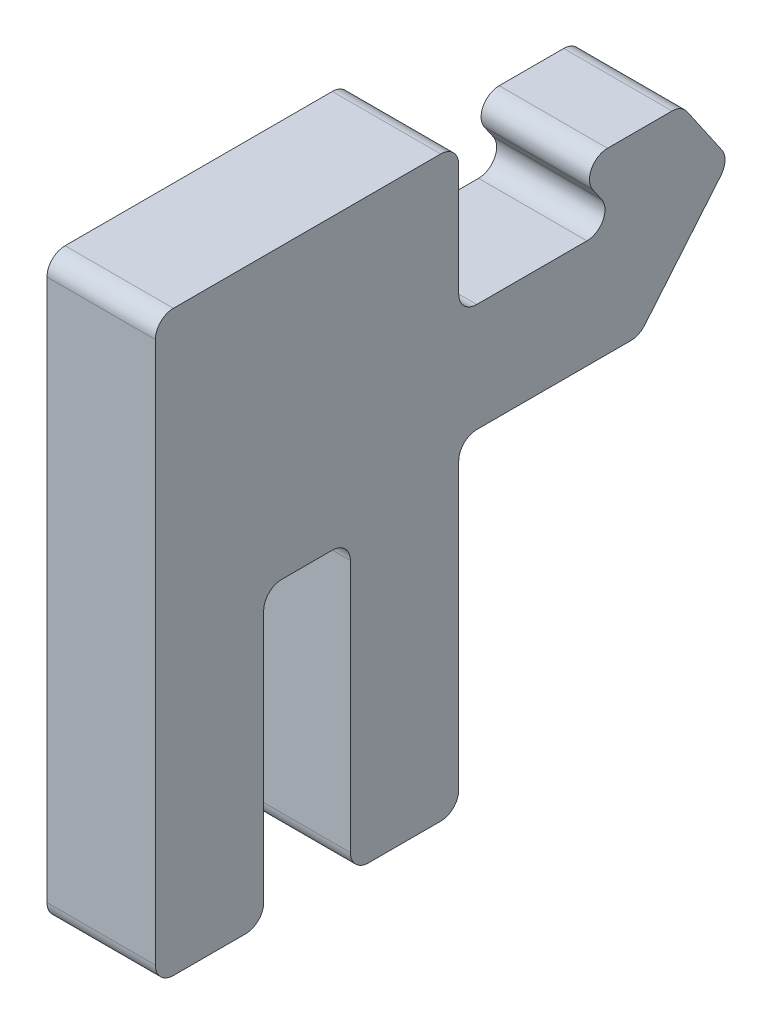
ISO-10303-21;
HEADER;
FILE_DESCRIPTION(('STEP AP214'),'2;1');
FILE_NAME('part.step','',(''),(''),'','','');
FILE_SCHEMA(('AUTOMOTIVE_DESIGN { 1 0 10303 214 1 1 1 1 }'));
ENDSEC;
DATA;
#1=APPLICATION_CONTEXT('core data for automotive mechanical design processes');
#2=APPLICATION_PROTOCOL_DEFINITION('international standard','automotive_design',2000,#1);
#3=PRODUCT_CONTEXT('',#1,'mechanical');
#4=PRODUCT('Part','Part','',(#3));
#5=PRODUCT_RELATED_PRODUCT_CATEGORY('part','',(#4));
#6=PRODUCT_DEFINITION_FORMATION('','',#4);
#7=PRODUCT_DEFINITION_CONTEXT('part definition',#1,'design');
#8=PRODUCT_DEFINITION('design','',#6,#7);
#9=PRODUCT_DEFINITION_SHAPE('','',#8);
#10=(LENGTH_UNIT() NAMED_UNIT(*) SI_UNIT(.MILLI.,.METRE.));
#11=(NAMED_UNIT(*) PLANE_ANGLE_UNIT() SI_UNIT($,.RADIAN.));
#12=(NAMED_UNIT(*) SI_UNIT($,.STERADIAN.) SOLID_ANGLE_UNIT());
#13=UNCERTAINTY_MEASURE_WITH_UNIT(LENGTH_MEASURE(1.E-05),#10,'distance_accuracy_value','');
#14=(GEOMETRIC_REPRESENTATION_CONTEXT(3) GLOBAL_UNCERTAINTY_ASSIGNED_CONTEXT((#13)) GLOBAL_UNIT_ASSIGNED_CONTEXT((#10,
#11,#12)) REPRESENTATION_CONTEXT('',''));
#15=CARTESIAN_POINT('',(0.,0.,0.));
#16=DIRECTION('',(0.,0.,1.));
#17=DIRECTION('',(1.,0.,0.));
#18=AXIS2_PLACEMENT_3D('',#15,#16,#17);
#19=CARTESIAN_POINT('',(3.,8.,-4.2));
#20=DIRECTION('',(0.,0.,1.));
#21=DIRECTION('',(0.,-1.,0.));
#22=AXIS2_PLACEMENT_3D('',#19,#20,#21);
#23=PLANE('',#22);
#24=DIRECTION('',(0.,1.,0.));
#25=VECTOR('',#24,1.);
#26=CARTESIAN_POINT('',(3.,8.,-4.2));
#27=LINE('',#26,#25);
#28=CARTESIAN_POINT('',(3.,4.39179828626601,-4.2));
#29=VERTEX_POINT('',#28);
#30=CARTESIAN_POINT('',(3.,7.5,-4.2));
#31=VERTEX_POINT('',#30);
#32=EDGE_CURVE('E352',#29,#31,#27,.T.);
#33=ORIENTED_EDGE('',*,*,#32,.F.);
#34=DIRECTION('',(1.,0.,0.));
#35=VECTOR('',#34,1.);
#36=CARTESIAN_POINT('',(3.,4.39179828626601,-4.2));
#37=LINE('',#36,#35);
#38=CARTESIAN_POINT('',(0.,4.39179828626601,-4.2));
#39=VERTEX_POINT('',#38);
#40=EDGE_CURVE('E573',#29,#39,#37,.F.);
#41=ORIENTED_EDGE('',*,*,#40,.T.);
#42=DIRECTION('',(0.,1.,0.));
#43=VECTOR('',#42,1.);
#44=CARTESIAN_POINT('',(0.,8.,-4.2));
#45=LINE('',#44,#43);
#46=CARTESIAN_POINT('',(0.,7.5,-4.2));
#47=VERTEX_POINT('',#46);
#48=EDGE_CURVE('E530',#39,#47,#45,.T.);
#49=ORIENTED_EDGE('',*,*,#48,.T.);
#50=DIRECTION('',(-1.,0.,0.));
#51=VECTOR('',#50,1.);
#52=CARTESIAN_POINT('',(3.,7.5,-4.2));
#53=LINE('',#52,#51);
#54=EDGE_CURVE('E571',#47,#31,#53,.F.);
#55=ORIENTED_EDGE('',*,*,#54,.T.);
#56=EDGE_LOOP('',(#33,#41,#49,#55));
#57=FACE_BOUND('',#56,.T.);
#58=ADVANCED_FACE('F46',(#57),#23,.F.);
#59=CARTESIAN_POINT('',(3.,-8.,4.2));
#60=DIRECTION('',(0.,1.,0.));
#61=DIRECTION('',(0.,0.,1.));
#62=AXIS2_PLACEMENT_3D('',#59,#60,#61);
#63=PLANE('',#62);
#64=DIRECTION('',(0.,0.,-1.));
#65=VECTOR('',#64,1.);
#66=CARTESIAN_POINT('',(0.,-8.,4.2));
#67=LINE('',#66,#65);
#68=CARTESIAN_POINT('',(0.,-8.,3.7));
#69=VERTEX_POINT('',#68);
#70=CARTESIAN_POINT('',(0.,-8.,1.7));
#71=VERTEX_POINT('',#70);
#72=EDGE_CURVE('E525',#69,#71,#67,.T.);
#73=ORIENTED_EDGE('',*,*,#72,.T.);
#74=DIRECTION('',(1.,0.,0.));
#75=VECTOR('',#74,1.);
#76=CARTESIAN_POINT('',(3.,-8.,1.7));
#77=LINE('',#76,#75);
#78=CARTESIAN_POINT('',(3.,-8.,1.7));
#79=VERTEX_POINT('',#78);
#80=EDGE_CURVE('E487',#71,#79,#77,.T.);
#81=ORIENTED_EDGE('',*,*,#80,.T.);
#82=DIRECTION('',(0.,0.,-1.));
#83=VECTOR('',#82,1.);
#84=CARTESIAN_POINT('',(3.,-8.,4.2));
#85=LINE('',#84,#83);
#86=CARTESIAN_POINT('',(3.,-8.,3.7));
#87=VERTEX_POINT('',#86);
#88=EDGE_CURVE('E347',#87,#79,#85,.T.);
#89=ORIENTED_EDGE('',*,*,#88,.F.);
#90=DIRECTION('',(-1.,0.,0.));
#91=VECTOR('',#90,1.);
#92=CARTESIAN_POINT('',(3.,-8.,3.7));
#93=LINE('',#92,#91);
#94=EDGE_CURVE('E483',#87,#69,#93,.T.);
#95=ORIENTED_EDGE('',*,*,#94,.T.);
#96=EDGE_LOOP('',(#73,#81,#89,#95));
#97=FACE_BOUND('',#96,.T.);
#98=ADVANCED_FACE('F527',(#97),#63,.F.);
#99=CARTESIAN_POINT('',(3.,8.,4.2));
#100=DIRECTION('',(0.,0.,-1.));
#101=DIRECTION('',(0.,1.,0.));
#102=AXIS2_PLACEMENT_3D('',#99,#100,#101);
#103=PLANE('',#102);
#104=DIRECTION('',(0.,-1.,0.));
#105=VECTOR('',#104,1.);
#106=CARTESIAN_POINT('',(3.,8.,4.2));
#107=LINE('',#106,#105);
#108=CARTESIAN_POINT('',(3.,7.5,4.2));
#109=VERTEX_POINT('',#108);
#110=CARTESIAN_POINT('',(3.,-7.5,4.2));
#111=VERTEX_POINT('',#110);
#112=EDGE_CURVE('E354',#109,#111,#107,.T.);
#113=ORIENTED_EDGE('',*,*,#112,.F.);
#114=DIRECTION('',(-1.,0.,0.));
#115=VECTOR('',#114,1.);
#116=CARTESIAN_POINT('',(3.,7.5,4.2));
#117=LINE('',#116,#115);
#118=CARTESIAN_POINT('',(0.,7.5,4.2));
#119=VERTEX_POINT('',#118);
#120=EDGE_CURVE('E291',#109,#119,#117,.T.);
#121=ORIENTED_EDGE('',*,*,#120,.T.);
#122=DIRECTION('',(0.,-1.,0.));
#123=VECTOR('',#122,1.);
#124=CARTESIAN_POINT('',(0.,8.,4.2));
#125=LINE('',#124,#123);
#126=CARTESIAN_POINT('',(0.,-7.5,4.2));
#127=VERTEX_POINT('',#126);
#128=EDGE_CURVE('E433',#119,#127,#125,.T.);
#129=ORIENTED_EDGE('',*,*,#128,.T.);
#130=DIRECTION('',(-1.,0.,0.));
#131=VECTOR('',#130,1.);
#132=CARTESIAN_POINT('',(3.,-7.5,4.2));
#133=LINE('',#132,#131);
#134=EDGE_CURVE('E288',#127,#111,#133,.F.);
#135=ORIENTED_EDGE('',*,*,#134,.T.);
#136=EDGE_LOOP('',(#113,#121,#129,#135));
#137=FACE_BOUND('',#136,.T.);
#138=ADVANCED_FACE('F634',(#137),#103,.F.);
#139=CARTESIAN_POINT('',(0.,-8.,-1.7));
#140=VERTEX_POINT('',#139);
#141=CARTESIAN_POINT('',(0.,-8.,-3.7));
#142=VERTEX_POINT('',#141);
#143=EDGE_CURVE('E531',#140,#142,#67,.T.);
#144=ORIENTED_EDGE('',*,*,#143,.T.);
#145=DIRECTION('',(-1.,0.,0.));
#146=VECTOR('',#145,1.);
#147=CARTESIAN_POINT('',(3.,-8.,-3.7));
#148=LINE('',#147,#146);
#149=CARTESIAN_POINT('',(3.,-8.,-3.7));
#150=VERTEX_POINT('',#149);
#151=EDGE_CURVE('E493',#142,#150,#148,.F.);
#152=ORIENTED_EDGE('',*,*,#151,.T.);
#153=CARTESIAN_POINT('',(3.,-8.,-1.7));
#154=VERTEX_POINT('',#153);
#155=EDGE_CURVE('E353',#154,#150,#85,.T.);
#156=ORIENTED_EDGE('',*,*,#155,.F.);
#157=DIRECTION('',(1.,0.,0.));
#158=VECTOR('',#157,1.);
#159=CARTESIAN_POINT('',(3.,-8.,-1.7));
#160=LINE('',#159,#158);
#161=EDGE_CURVE('E490',#154,#140,#160,.F.);
#162=ORIENTED_EDGE('',*,*,#161,.T.);
#163=EDGE_LOOP('',(#144,#152,#156,#162));
#164=FACE_BOUND('',#163,.T.);
#165=ADVANCED_FACE('F652',(#164),#63,.F.);
#166=CARTESIAN_POINT('',(0.,-7.5,-4.2));
#167=VERTEX_POINT('',#166);
#168=CARTESIAN_POINT('',(0.,0.391798286266009,-4.2));
#169=VERTEX_POINT('',#168);
#170=EDGE_CURVE('E536',#167,#169,#45,.T.);
#171=ORIENTED_EDGE('',*,*,#170,.T.);
#172=DIRECTION('',(1.,0.,0.));
#173=VECTOR('',#172,1.);
#174=CARTESIAN_POINT('',(3.,0.391798286266009,-4.2));
#175=LINE('',#174,#173);
#176=CARTESIAN_POINT('',(3.,0.391798286266009,-4.2));
#177=VERTEX_POINT('',#176);
#178=EDGE_CURVE('E460',#169,#177,#175,.T.);
#179=ORIENTED_EDGE('',*,*,#178,.T.);
#180=CARTESIAN_POINT('',(3.,-7.5,-4.2));
#181=VERTEX_POINT('',#180);
#182=EDGE_CURVE('E612',#181,#177,#27,.T.);
#183=ORIENTED_EDGE('',*,*,#182,.F.);
#184=DIRECTION('',(-1.,0.,0.));
#185=VECTOR('',#184,1.);
#186=CARTESIAN_POINT('',(3.,-7.5,-4.2));
#187=LINE('',#186,#185);
#188=EDGE_CURVE('E467',#181,#167,#187,.T.);
#189=ORIENTED_EDGE('',*,*,#188,.T.);
#190=EDGE_LOOP('',(#171,#179,#183,#189));
#191=FACE_BOUND('',#190,.T.);
#192=ADVANCED_FACE('F647',(#191),#23,.F.);
#193=CARTESIAN_POINT('',(3.,8.,4.2));
#194=DIRECTION('',(0.,-1.,0.));
#195=DIRECTION('',(0.,0.,-1.));
#196=AXIS2_PLACEMENT_3D('',#193,#194,#195);
#197=PLANE('',#196);
#198=DIRECTION('',(0.,0.,1.));
#199=VECTOR('',#198,1.);
#200=CARTESIAN_POINT('',(0.,8.,4.2));
#201=LINE('',#200,#199);
#202=CARTESIAN_POINT('',(0.,8.,-3.7));
#203=VERTEX_POINT('',#202);
#204=CARTESIAN_POINT('',(0.,8.,3.7));
#205=VERTEX_POINT('',#204);
#206=EDGE_CURVE('E542',#203,#205,#201,.T.);
#207=ORIENTED_EDGE('',*,*,#206,.T.);
#208=DIRECTION('',(-1.,0.,0.));
#209=VECTOR('',#208,1.);
#210=CARTESIAN_POINT('',(3.,8.,3.7));
#211=LINE('',#210,#209);
#212=CARTESIAN_POINT('',(3.,8.,3.7));
#213=VERTEX_POINT('',#212);
#214=EDGE_CURVE('E329',#205,#213,#211,.F.);
#215=ORIENTED_EDGE('',*,*,#214,.T.);
#216=DIRECTION('',(0.,0.,1.));
#217=VECTOR('',#216,1.);
#218=CARTESIAN_POINT('',(3.,8.,4.2));
#219=LINE('',#218,#217);
#220=CARTESIAN_POINT('',(3.,8.,-3.7));
#221=VERTEX_POINT('',#220);
#222=EDGE_CURVE('E282',#221,#213,#219,.T.);
#223=ORIENTED_EDGE('',*,*,#222,.F.);
#224=DIRECTION('',(-1.,0.,0.));
#225=VECTOR('',#224,1.);
#226=CARTESIAN_POINT('',(3.,8.,-3.7));
#227=LINE('',#226,#225);
#228=EDGE_CURVE('E325',#221,#203,#227,.T.);
#229=ORIENTED_EDGE('',*,*,#228,.T.);
#230=EDGE_LOOP('',(#207,#215,#223,#229));
#231=FACE_BOUND('',#230,.T.);
#232=ADVANCED_FACE('F627',(#231),#197,.F.);
#233=CARTESIAN_POINT('',(3.,0.,0.));
#234=DIRECTION('',(1.,0.,0.));
#235=DIRECTION('',(0.,0.,-1.));
#236=AXIS2_PLACEMENT_3D('',#233,#234,#235);
#237=PLANE('',#236);
#238=ORIENTED_EDGE('',*,*,#222,.T.);
#239=CARTESIAN_POINT('',(3.,7.5,3.7));
#240=DIRECTION('',(1.,0.,0.));
#241=DIRECTION('',(0.,0.,-1.));
#242=AXIS2_PLACEMENT_3D('',#239,#240,#241);
#243=CIRCLE('',#242,0.5);
#244=EDGE_CURVE('E569',#213,#109,#243,.T.);
#245=ORIENTED_EDGE('',*,*,#244,.T.);
#246=ORIENTED_EDGE('',*,*,#112,.T.);
#247=CARTESIAN_POINT('',(3.,-7.5,3.7));
#248=DIRECTION('',(1.,0.,0.));
#249=DIRECTION('',(0.,0.,-1.));
#250=AXIS2_PLACEMENT_3D('',#247,#248,#249);
#251=CIRCLE('',#250,0.5);
#252=EDGE_CURVE('E70',#111,#87,#251,.T.);
#253=ORIENTED_EDGE('',*,*,#252,.T.);
#254=ORIENTED_EDGE('',*,*,#88,.T.);
#255=CARTESIAN_POINT('',(3.,-7.5,1.7));
#256=DIRECTION('',(1.,0.,0.));
#257=DIRECTION('',(0.,0.,-1.));
#258=AXIS2_PLACEMENT_3D('',#255,#256,#257);
#259=CIRCLE('',#258,0.5);
#260=CARTESIAN_POINT('',(3.,-7.5,1.2));
#261=VERTEX_POINT('',#260);
#262=EDGE_CURVE('E62',#79,#261,#259,.T.);
#263=ORIENTED_EDGE('',*,*,#262,.T.);
#264=DIRECTION('',(0.,-1.,0.));
#265=VECTOR('',#264,1.);
#266=CARTESIAN_POINT('',(3.,-8.,1.2));
#267=LINE('',#266,#265);
#268=CARTESIAN_POINT('',(3.,-0.5,1.2));
#269=VERTEX_POINT('',#268);
#270=EDGE_CURVE('E434',#269,#261,#267,.T.);
#271=ORIENTED_EDGE('',*,*,#270,.F.);
#272=CARTESIAN_POINT('',(3.,-0.5,0.699999999999999));
#273=DIRECTION('',(1.,0.,0.));
#274=DIRECTION('',(0.,0.,-1.));
#275=AXIS2_PLACEMENT_3D('',#272,#273,#274);
#276=CIRCLE('',#275,0.5);
#277=CARTESIAN_POINT('',(3.,0.,0.699999999999999));
#278=VERTEX_POINT('',#277);
#279=EDGE_CURVE('E55',#269,#278,#276,.F.);
#280=ORIENTED_EDGE('',*,*,#279,.T.);
#281=DIRECTION('',(0.,0.,1.));
#282=VECTOR('',#281,1.);
#283=CARTESIAN_POINT('',(3.,0.,1.2));
#284=LINE('',#283,#282);
#285=CARTESIAN_POINT('',(3.,0.,-0.700000000000001));
#286=VERTEX_POINT('',#285);
#287=EDGE_CURVE('E426',#286,#278,#284,.T.);
#288=ORIENTED_EDGE('',*,*,#287,.F.);
#289=CARTESIAN_POINT('',(3.,-0.5,-0.700000000000001));
#290=DIRECTION('',(1.,0.,0.));
#291=DIRECTION('',(0.,0.,-1.));
#292=AXIS2_PLACEMENT_3D('',#289,#290,#291);
#293=CIRCLE('',#292,0.5);
#294=CARTESIAN_POINT('',(3.,-0.5,-1.2));
#295=VERTEX_POINT('',#294);
#296=EDGE_CURVE('E509',#286,#295,#293,.F.);
#297=ORIENTED_EDGE('',*,*,#296,.T.);
#298=DIRECTION('',(0.,1.,0.));
#299=VECTOR('',#298,1.);
#300=CARTESIAN_POINT('',(3.,-8.,-1.2));
#301=LINE('',#300,#299);
#302=CARTESIAN_POINT('',(3.,-7.5,-1.2));
#303=VERTEX_POINT('',#302);
#304=EDGE_CURVE('E438',#303,#295,#301,.T.);
#305=ORIENTED_EDGE('',*,*,#304,.F.);
#306=CARTESIAN_POINT('',(3.,-7.5,-1.7));
#307=DIRECTION('',(1.,0.,0.));
#308=DIRECTION('',(0.,0.,-1.));
#309=AXIS2_PLACEMENT_3D('',#306,#307,#308);
#310=CIRCLE('',#309,0.5);
#311=EDGE_CURVE('E332',#303,#154,#310,.T.);
#312=ORIENTED_EDGE('',*,*,#311,.T.);
#313=ORIENTED_EDGE('',*,*,#155,.T.);
#314=CARTESIAN_POINT('',(3.,-7.5,-3.7));
#315=DIRECTION('',(1.,0.,0.));
#316=DIRECTION('',(0.,0.,-1.));
#317=AXIS2_PLACEMENT_3D('',#314,#315,#316);
#318=CIRCLE('',#317,0.5);
#319=EDGE_CURVE('E336',#150,#181,#318,.T.);
#320=ORIENTED_EDGE('',*,*,#319,.T.);
#321=ORIENTED_EDGE('',*,*,#182,.T.);
#322=CARTESIAN_POINT('',(3.,0.391798286266009,-4.7));
#323=DIRECTION('',(1.,0.,0.));
#324=DIRECTION('',(0.,0.,-1.));
#325=AXIS2_PLACEMENT_3D('',#322,#323,#324);
#326=CIRCLE('',#325,0.5);
#327=CARTESIAN_POINT('',(3.,0.891798286266009,-4.7));
#328=VERTEX_POINT('',#327);
#329=EDGE_CURVE('E503',#177,#328,#326,.F.);
#330=ORIENTED_EDGE('',*,*,#329,.T.);
#331=DIRECTION('',(0.,0.,-1.));
#332=VECTOR('',#331,1.);
#333=CARTESIAN_POINT('',(3.,0.891798286266009,-4.2));
#334=LINE('',#333,#332);
#335=CARTESIAN_POINT('',(3.,0.891798286266009,-8.96577293926334));
#336=VERTEX_POINT('',#335);
#337=EDGE_CURVE('E391',#328,#336,#334,.T.);
#338=ORIENTED_EDGE('',*,*,#337,.T.);
#339=CARTESIAN_POINT('',(3.,1.39179828626601,-8.96577293926334));
#340=DIRECTION('',(1.,0.,0.));
#341=DIRECTION('',(0.,0.,-1.));
#342=AXIS2_PLACEMENT_3D('',#339,#340,#341);
#343=CIRCLE('',#342,0.5);
#344=CARTESIAN_POINT('',(3.,1.07175596914569,-9.34992514250089));
#345=VERTEX_POINT('',#344);
#346=EDGE_CURVE('E370',#336,#345,#343,.T.);
#347=ORIENTED_EDGE('',*,*,#346,.T.);
#348=DIRECTION('',(0.,0.768304406475082,-0.640084634240638));
#349=VECTOR('',#348,1.);
#350=CARTESIAN_POINT('',(3.,3.89223232488485,-11.6997015609786));
#351=LINE('',#350,#349);
#352=CARTESIAN_POINT('',(3.,3.60112012545846,-11.4571721102525));
#353=VERTEX_POINT('',#352);
#354=EDGE_CURVE('E385',#345,#353,#351,.T.);
#355=ORIENTED_EDGE('',*,*,#354,.T.);
#356=CARTESIAN_POINT('',(3.,3.92116244257878,-11.073019907015));
#357=DIRECTION('',(1.,0.,0.));
#358=DIRECTION('',(0.,0.,-1.));
#359=AXIS2_PLACEMENT_3D('',#356,#357,#358);
#360=CIRCLE('',#359,0.5);
#361=CARTESIAN_POINT('',(3.,4.20445100629569,-11.4850242633842));
#362=VERTEX_POINT('',#361);
#363=EDGE_CURVE('E375',#353,#362,#360,.T.);
#364=ORIENTED_EDGE('',*,*,#363,.T.);
#365=DIRECTION('',(0.,0.824008712738434,0.566577127433811));
#366=VECTOR('',#365,1.);
#367=CARTESIAN_POINT('',(3.,5.82740146716744,-10.3691057107366));
#368=LINE('',#367,#366);
#369=CARTESIAN_POINT('',(3.,5.61069003088435,-10.5181135320778));
#370=VERTEX_POINT('',#369);
#371=EDGE_CURVE('E390',#362,#370,#368,.T.);
#372=ORIENTED_EDGE('',*,*,#371,.T.);
#373=CARTESIAN_POINT('',(3.,5.32740146716744,-10.1061091757086));
#374=DIRECTION('',(1.,0.,0.));
#375=DIRECTION('',(0.,0.,-1.));
#376=AXIS2_PLACEMENT_3D('',#373,#374,#375);
#377=CIRCLE('',#376,0.5);
#378=CARTESIAN_POINT('',(3.,5.82740146716744,-10.1061091757086));
#379=VERTEX_POINT('',#378);
#380=EDGE_CURVE('E404',#370,#379,#377,.T.);
#381=ORIENTED_EDGE('',*,*,#380,.T.);
#382=DIRECTION('',(0.,0.,1.));
#383=VECTOR('',#382,1.);
#384=CARTESIAN_POINT('',(3.,5.82740146716744,-7.36910571073658));
#385=LINE('',#384,#383);
#386=CARTESIAN_POINT('',(3.,5.82740146716744,-8.31968857667959));
#387=VERTEX_POINT('',#386);
#388=EDGE_CURVE('E398',#379,#387,#385,.T.);
#389=ORIENTED_EDGE('',*,*,#388,.T.);
#390=CARTESIAN_POINT('',(3.,5.32740146716744,-8.31968857667959));
#391=DIRECTION('',(1.,0.,0.));
#392=DIRECTION('',(0.,0.,-1.));
#393=AXIS2_PLACEMENT_3D('',#390,#391,#392);
#394=CIRCLE('',#393,0.5);
#395=CARTESIAN_POINT('',(3.,5.04411290345053,-7.90768422031037));
#396=VERTEX_POINT('',#395);
#397=EDGE_CURVE('E408',#387,#396,#394,.T.);
#398=ORIENTED_EDGE('',*,*,#397,.T.);
#399=DIRECTION('',(0.,-0.824008712738433,-0.566577127433812));
#400=VECTOR('',#399,1.);
#401=CARTESIAN_POINT('',(3.,5.82740146716744,-7.36910571073658));
#402=LINE('',#401,#400);
#403=CARTESIAN_POINT('',(3.,4.67508684998292,-8.16142149042621));
#404=VERTEX_POINT('',#403);
#405=EDGE_CURVE('E416',#396,#404,#402,.T.);
#406=ORIENTED_EDGE('',*,*,#405,.T.);
#407=CARTESIAN_POINT('',(3.,4.39179828626601,-7.749417134057));
#408=DIRECTION('',(1.,0.,0.));
#409=DIRECTION('',(0.,0.,-1.));
#410=AXIS2_PLACEMENT_3D('',#407,#408,#409);
#411=CIRCLE('',#410,0.5);
#412=CARTESIAN_POINT('',(3.,3.89179828626601,-7.749417134057));
#413=VERTEX_POINT('',#412);
#414=EDGE_CURVE('E260',#404,#413,#411,.F.);
#415=ORIENTED_EDGE('',*,*,#414,.T.);
#416=DIRECTION('',(0.,0.,1.));
#417=VECTOR('',#416,1.);
#418=CARTESIAN_POINT('',(3.,3.89179828626601,-8.7));
#419=LINE('',#418,#417);
#420=CARTESIAN_POINT('',(3.,3.89179828626601,-4.7));
#421=VERTEX_POINT('',#420);
#422=EDGE_CURVE('E672',#413,#421,#419,.T.);
#423=ORIENTED_EDGE('',*,*,#422,.T.);
#424=CARTESIAN_POINT('',(3.,4.39179828626601,-4.7));
#425=DIRECTION('',(1.,0.,0.));
#426=DIRECTION('',(0.,0.,-1.));
#427=AXIS2_PLACEMENT_3D('',#424,#425,#426);
#428=CIRCLE('',#427,0.5);
#429=EDGE_CURVE('E259',#421,#29,#428,.F.);
#430=ORIENTED_EDGE('',*,*,#429,.T.);
#431=ORIENTED_EDGE('',*,*,#32,.T.);
#432=CARTESIAN_POINT('',(3.,7.5,-3.7));
#433=DIRECTION('',(1.,0.,0.));
#434=DIRECTION('',(0.,0.,-1.));
#435=AXIS2_PLACEMENT_3D('',#432,#433,#434);
#436=CIRCLE('',#435,0.5);
#437=EDGE_CURVE('E411',#31,#221,#436,.T.);
#438=ORIENTED_EDGE('',*,*,#437,.T.);
#439=EDGE_LOOP('',(#238,#245,#246,#253,#254,#263,#271,#280,#288,#297,#305,#312,#313,#320,#321,
#330,#338,#347,#355,#364,#372,#381,#389,#398,#406,#415,#423,#430,#431,#438));
#440=FACE_BOUND('',#439,.T.);
#441=ADVANCED_FACE('F517',(#440),#237,.T.);
#442=CARTESIAN_POINT('',(0.,0.,0.));
#443=DIRECTION('',(1.,0.,0.));
#444=DIRECTION('',(0.,0.,-1.));
#445=AXIS2_PLACEMENT_3D('',#442,#443,#444);
#446=PLANE('',#445);
#447=ORIENTED_EDGE('',*,*,#128,.F.);
#448=CARTESIAN_POINT('',(0.,7.5,3.7));
#449=DIRECTION('',(1.,0.,0.));
#450=DIRECTION('',(0.,0.,-1.));
#451=AXIS2_PLACEMENT_3D('',#448,#449,#450);
#452=CIRCLE('',#451,0.5);
#453=EDGE_CURVE('E322',#119,#205,#452,.F.);
#454=ORIENTED_EDGE('',*,*,#453,.T.);
#455=ORIENTED_EDGE('',*,*,#206,.F.);
#456=CARTESIAN_POINT('',(0.,7.5,-3.7));
#457=DIRECTION('',(1.,0.,0.));
#458=DIRECTION('',(0.,0.,-1.));
#459=AXIS2_PLACEMENT_3D('',#456,#457,#458);
#460=CIRCLE('',#459,0.5);
#461=EDGE_CURVE('E319',#203,#47,#460,.F.);
#462=ORIENTED_EDGE('',*,*,#461,.T.);
#463=ORIENTED_EDGE('',*,*,#48,.F.);
#464=CARTESIAN_POINT('',(0.,4.39179828626601,-4.7));
#465=DIRECTION('',(1.,0.,0.));
#466=DIRECTION('',(0.,0.,-1.));
#467=AXIS2_PLACEMENT_3D('',#464,#465,#466);
#468=CIRCLE('',#467,0.5);
#469=CARTESIAN_POINT('',(0.,3.89179828626601,-4.7));
#470=VERTEX_POINT('',#469);
#471=EDGE_CURVE('E500',#39,#470,#468,.T.);
#472=ORIENTED_EDGE('',*,*,#471,.T.);
#473=DIRECTION('',(0.,0.,-1.));
#474=VECTOR('',#473,1.);
#475=CARTESIAN_POINT('',(0.,3.89179828626601,-8.7));
#476=LINE('',#475,#474);
#477=CARTESIAN_POINT('',(0.,3.89179828626601,-7.749417134057));
#478=VERTEX_POINT('',#477);
#479=EDGE_CURVE('E254',#470,#478,#476,.T.);
#480=ORIENTED_EDGE('',*,*,#479,.T.);
#481=CARTESIAN_POINT('',(0.,4.39179828626601,-7.749417134057));
#482=DIRECTION('',(1.,0.,0.));
#483=DIRECTION('',(0.,0.,-1.));
#484=AXIS2_PLACEMENT_3D('',#481,#482,#483);
#485=CIRCLE('',#484,0.5);
#486=CARTESIAN_POINT('',(0.,4.67508684998292,-8.16142149042621));
#487=VERTEX_POINT('',#486);
#488=EDGE_CURVE('E247',#478,#487,#485,.T.);
#489=ORIENTED_EDGE('',*,*,#488,.T.);
#490=DIRECTION('',(0.,0.824008712738434,0.566577127433812));
#491=VECTOR('',#490,1.);
#492=CARTESIAN_POINT('',(0.,5.82740146716744,-7.36910571073658));
#493=LINE('',#492,#491);
#494=CARTESIAN_POINT('',(0.,5.04411290345053,-7.90768422031037));
#495=VERTEX_POINT('',#494);
#496=EDGE_CURVE('E251',#487,#495,#493,.T.);
#497=ORIENTED_EDGE('',*,*,#496,.T.);
#498=CARTESIAN_POINT('',(0.,5.32740146716744,-8.31968857667959));
#499=DIRECTION('',(1.,0.,0.));
#500=DIRECTION('',(0.,0.,-1.));
#501=AXIS2_PLACEMENT_3D('',#498,#499,#500);
#502=CIRCLE('',#501,0.5);
#503=CARTESIAN_POINT('',(0.,5.82740146716744,-8.31968857667959));
#504=VERTEX_POINT('',#503);
#505=EDGE_CURVE('E316',#495,#504,#502,.F.);
#506=ORIENTED_EDGE('',*,*,#505,.T.);
#507=DIRECTION('',(0.,0.,-1.));
#508=VECTOR('',#507,1.);
#509=CARTESIAN_POINT('',(0.,5.82740146716744,-7.36910571073658));
#510=LINE('',#509,#508);
#511=CARTESIAN_POINT('',(0.,5.82740146716744,-10.1061091757086));
#512=VERTEX_POINT('',#511);
#513=EDGE_CURVE('E271',#504,#512,#510,.T.);
#514=ORIENTED_EDGE('',*,*,#513,.T.);
#515=CARTESIAN_POINT('',(0.,5.32740146716744,-10.1061091757086));
#516=DIRECTION('',(1.,0.,0.));
#517=DIRECTION('',(0.,0.,-1.));
#518=AXIS2_PLACEMENT_3D('',#515,#516,#517);
#519=CIRCLE('',#518,0.5);
#520=CARTESIAN_POINT('',(0.,5.61069003088435,-10.5181135320778));
#521=VERTEX_POINT('',#520);
#522=EDGE_CURVE('E313',#512,#521,#519,.F.);
#523=ORIENTED_EDGE('',*,*,#522,.T.);
#524=DIRECTION('',(0.,-0.824008712738434,-0.566577127433811));
#525=VECTOR('',#524,1.);
#526=CARTESIAN_POINT('',(0.,5.82740146716744,-10.3691057107366));
#527=LINE('',#526,#525);
#528=CARTESIAN_POINT('',(0.,4.20445100629569,-11.4850242633842));
#529=VERTEX_POINT('',#528);
#530=EDGE_CURVE('E682',#521,#529,#527,.T.);
#531=ORIENTED_EDGE('',*,*,#530,.T.);
#532=CARTESIAN_POINT('',(0.,3.92116244257878,-11.073019907015));
#533=DIRECTION('',(1.,0.,0.));
#534=DIRECTION('',(0.,0.,-1.));
#535=AXIS2_PLACEMENT_3D('',#532,#533,#534);
#536=CIRCLE('',#535,0.5);
#537=CARTESIAN_POINT('',(0.,3.60112012545846,-11.4571721102525));
#538=VERTEX_POINT('',#537);
#539=EDGE_CURVE('E310',#529,#538,#536,.F.);
#540=ORIENTED_EDGE('',*,*,#539,.T.);
#541=DIRECTION('',(0.,-0.768304406475082,0.640084634240638));
#542=VECTOR('',#541,1.);
#543=CARTESIAN_POINT('',(0.,3.89223232488485,-11.6997015609786));
#544=LINE('',#543,#542);
#545=CARTESIAN_POINT('',(0.,1.07175596914569,-9.34992514250089));
#546=VERTEX_POINT('',#545);
#547=EDGE_CURVE('E686',#538,#546,#544,.T.);
#548=ORIENTED_EDGE('',*,*,#547,.T.);
#549=CARTESIAN_POINT('',(0.,1.39179828626601,-8.96577293926334));
#550=DIRECTION('',(1.,0.,0.));
#551=DIRECTION('',(0.,0.,-1.));
#552=AXIS2_PLACEMENT_3D('',#549,#550,#551);
#553=CIRCLE('',#552,0.5);
#554=CARTESIAN_POINT('',(0.,0.891798286266009,-8.96577293926334));
#555=VERTEX_POINT('',#554);
#556=EDGE_CURVE('E307',#546,#555,#553,.F.);
#557=ORIENTED_EDGE('',*,*,#556,.T.);
#558=DIRECTION('',(0.,0.,1.));
#559=VECTOR('',#558,1.);
#560=CARTESIAN_POINT('',(0.,0.891798286266009,-4.2));
#561=LINE('',#560,#559);
#562=CARTESIAN_POINT('',(0.,0.891798286266009,-4.7));
#563=VERTEX_POINT('',#562);
#564=EDGE_CURVE('E420',#555,#563,#561,.T.);
#565=ORIENTED_EDGE('',*,*,#564,.T.);
#566=CARTESIAN_POINT('',(0.,0.391798286266009,-4.7));
#567=DIRECTION('',(1.,0.,0.));
#568=DIRECTION('',(0.,0.,-1.));
#569=AXIS2_PLACEMENT_3D('',#566,#567,#568);
#570=CIRCLE('',#569,0.5);
#571=EDGE_CURVE('E506',#563,#169,#570,.T.);
#572=ORIENTED_EDGE('',*,*,#571,.T.);
#573=ORIENTED_EDGE('',*,*,#170,.F.);
#574=CARTESIAN_POINT('',(0.,-7.5,-3.7));
#575=DIRECTION('',(1.,0.,0.));
#576=DIRECTION('',(0.,0.,-1.));
#577=AXIS2_PLACEMENT_3D('',#574,#575,#576);
#578=CIRCLE('',#577,0.5);
#579=EDGE_CURVE('E298',#167,#142,#578,.F.);
#580=ORIENTED_EDGE('',*,*,#579,.T.);
#581=ORIENTED_EDGE('',*,*,#143,.F.);
#582=CARTESIAN_POINT('',(0.,-7.5,-1.7));
#583=DIRECTION('',(1.,0.,0.));
#584=DIRECTION('',(0.,0.,-1.));
#585=AXIS2_PLACEMENT_3D('',#582,#583,#584);
#586=CIRCLE('',#585,0.5);
#587=CARTESIAN_POINT('',(0.,-7.5,-1.2));
#588=VERTEX_POINT('',#587);
#589=EDGE_CURVE('E295',#140,#588,#586,.F.);
#590=ORIENTED_EDGE('',*,*,#589,.T.);
#591=DIRECTION('',(0.,-1.,0.));
#592=VECTOR('',#591,1.);
#593=CARTESIAN_POINT('',(0.,-8.,-1.2));
#594=LINE('',#593,#592);
#595=CARTESIAN_POINT('',(0.,-0.5,-1.2));
#596=VERTEX_POINT('',#595);
#597=EDGE_CURVE('E421',#596,#588,#594,.T.);
#598=ORIENTED_EDGE('',*,*,#597,.F.);
#599=CARTESIAN_POINT('',(0.,-0.5,-0.700000000000001));
#600=DIRECTION('',(1.,0.,0.));
#601=DIRECTION('',(0.,0.,-1.));
#602=AXIS2_PLACEMENT_3D('',#599,#600,#601);
#603=CIRCLE('',#602,0.5);
#604=CARTESIAN_POINT('',(0.,0.,-0.700000000000001));
#605=VERTEX_POINT('',#604);
#606=EDGE_CURVE('E512',#596,#605,#603,.T.);
#607=ORIENTED_EDGE('',*,*,#606,.T.);
#608=DIRECTION('',(0.,0.,-1.));
#609=VECTOR('',#608,1.);
#610=CARTESIAN_POINT('',(0.,0.,1.2));
#611=LINE('',#610,#609);
#612=CARTESIAN_POINT('',(0.,0.,0.699999999999999));
#613=VERTEX_POINT('',#612);
#614=EDGE_CURVE('E425',#613,#605,#611,.T.);
#615=ORIENTED_EDGE('',*,*,#614,.F.);
#616=CARTESIAN_POINT('',(0.,-0.5,0.699999999999999));
#617=DIRECTION('',(1.,0.,0.));
#618=DIRECTION('',(0.,0.,-1.));
#619=AXIS2_PLACEMENT_3D('',#616,#617,#618);
#620=CIRCLE('',#619,0.5);
#621=CARTESIAN_POINT('',(0.,-0.5,1.2));
#622=VERTEX_POINT('',#621);
#623=EDGE_CURVE('E12',#613,#622,#620,.T.);
#624=ORIENTED_EDGE('',*,*,#623,.T.);
#625=DIRECTION('',(0.,1.,0.));
#626=VECTOR('',#625,1.);
#627=CARTESIAN_POINT('',(0.,-8.,1.2));
#628=LINE('',#627,#626);
#629=CARTESIAN_POINT('',(0.,-7.5,1.2));
#630=VERTEX_POINT('',#629);
#631=EDGE_CURVE('E430',#630,#622,#628,.T.);
#632=ORIENTED_EDGE('',*,*,#631,.F.);
#633=CARTESIAN_POINT('',(0.,-7.5,1.7));
#634=DIRECTION('',(1.,0.,0.));
#635=DIRECTION('',(0.,0.,-1.));
#636=AXIS2_PLACEMENT_3D('',#633,#634,#635);
#637=CIRCLE('',#636,0.5);
#638=EDGE_CURVE('E304',#630,#71,#637,.F.);
#639=ORIENTED_EDGE('',*,*,#638,.T.);
#640=ORIENTED_EDGE('',*,*,#72,.F.);
#641=CARTESIAN_POINT('',(0.,-7.5,3.7));
#642=DIRECTION('',(1.,0.,0.));
#643=DIRECTION('',(0.,0.,-1.));
#644=AXIS2_PLACEMENT_3D('',#641,#642,#643);
#645=CIRCLE('',#644,0.5);
#646=EDGE_CURVE('E301',#69,#127,#645,.F.);
#647=ORIENTED_EDGE('',*,*,#646,.T.);
#648=EDGE_LOOP('',(#447,#454,#455,#462,#463,#472,#480,#489,#497,#506,#514,#523,#531,#540,#548,
#557,#565,#572,#573,#580,#581,#590,#598,#607,#615,#624,#632,#639,#640,#647));
#649=FACE_BOUND('',#648,.T.);
#650=ADVANCED_FACE('F250',(#649),#446,.F.);
#651=CARTESIAN_POINT('',(-8.35224520712844,-8.,1.2));
#652=DIRECTION('',(0.,0.,1.));
#653=DIRECTION('',(1.,0.,0.));
#654=AXIS2_PLACEMENT_3D('',#651,#652,#653);
#655=PLANE('',#654);
#656=ORIENTED_EDGE('',*,*,#631,.T.);
#657=DIRECTION('',(1.,0.,0.));
#658=VECTOR('',#657,1.);
#659=CARTESIAN_POINT('',(3.,-0.5,1.2));
#660=LINE('',#659,#658);
#661=EDGE_CURVE('E480',#622,#269,#660,.T.);
#662=ORIENTED_EDGE('',*,*,#661,.T.);
#663=ORIENTED_EDGE('',*,*,#270,.T.);
#664=DIRECTION('',(1.,0.,0.));
#665=VECTOR('',#664,1.);
#666=CARTESIAN_POINT('',(-8.35224520712844,-7.5,1.2));
#667=LINE('',#666,#665);
#668=EDGE_CURVE('E477',#261,#630,#667,.F.);
#669=ORIENTED_EDGE('',*,*,#668,.T.);
#670=EDGE_LOOP('',(#656,#662,#663,#669));
#671=FACE_BOUND('',#670,.T.);
#672=ADVANCED_FACE('F519',(#671),#655,.F.);
#673=CARTESIAN_POINT('',(-8.35224520712844,0.,1.2));
#674=DIRECTION('',(0.,1.,0.));
#675=DIRECTION('',(0.,0.,1.));
#676=AXIS2_PLACEMENT_3D('',#673,#674,#675);
#677=PLANE('',#676);
#678=ORIENTED_EDGE('',*,*,#614,.T.);
#679=DIRECTION('',(1.,0.,0.));
#680=VECTOR('',#679,1.);
#681=CARTESIAN_POINT('',(3.,0.,-0.700000000000001));
#682=LINE('',#681,#680);
#683=EDGE_CURVE('E453',#605,#286,#682,.T.);
#684=ORIENTED_EDGE('',*,*,#683,.T.);
#685=ORIENTED_EDGE('',*,*,#287,.T.);
#686=DIRECTION('',(1.,0.,0.));
#687=VECTOR('',#686,1.);
#688=CARTESIAN_POINT('',(0.,0.,0.699999999999999));
#689=LINE('',#688,#687);
#690=EDGE_CURVE('E450',#278,#613,#689,.F.);
#691=ORIENTED_EDGE('',*,*,#690,.T.);
#692=EDGE_LOOP('',(#678,#684,#685,#691));
#693=FACE_BOUND('',#692,.T.);
#694=ADVANCED_FACE('F449',(#693),#677,.F.);
#695=CARTESIAN_POINT('',(-8.35224520712844,-8.,-1.2));
#696=DIRECTION('',(0.,0.,-1.));
#697=DIRECTION('',(-1.,0.,0.));
#698=AXIS2_PLACEMENT_3D('',#695,#696,#697);
#699=PLANE('',#698);
#700=ORIENTED_EDGE('',*,*,#304,.T.);
#701=DIRECTION('',(1.,0.,0.));
#702=VECTOR('',#701,1.);
#703=CARTESIAN_POINT('',(0.,-0.5,-1.2));
#704=LINE('',#703,#702);
#705=EDGE_CURVE('E474',#295,#596,#704,.F.);
#706=ORIENTED_EDGE('',*,*,#705,.T.);
#707=ORIENTED_EDGE('',*,*,#597,.T.);
#708=DIRECTION('',(1.,0.,0.));
#709=VECTOR('',#708,1.);
#710=CARTESIAN_POINT('',(-8.35224520712844,-7.5,-1.2));
#711=LINE('',#710,#709);
#712=EDGE_CURVE('E464',#588,#303,#711,.T.);
#713=ORIENTED_EDGE('',*,*,#712,.T.);
#714=EDGE_LOOP('',(#700,#706,#707,#713));
#715=FACE_BOUND('',#714,.T.);
#716=ADVANCED_FACE('F899',(#715),#699,.F.);
#717=CARTESIAN_POINT('',(-8.9780678468738,3.89179828626601,-8.7));
#718=DIRECTION('',(0.,1.,0.));
#719=DIRECTION('',(0.,0.,1.));
#720=AXIS2_PLACEMENT_3D('',#717,#718,#719);
#721=PLANE('',#720);
#722=ORIENTED_EDGE('',*,*,#422,.F.);
#723=DIRECTION('',(1.,0.,0.));
#724=VECTOR('',#723,1.);
#725=CARTESIAN_POINT('',(0.,3.89179828626601,-7.749417134057));
#726=LINE('',#725,#724);
#727=EDGE_CURVE('E280',#413,#478,#726,.F.);
#728=ORIENTED_EDGE('',*,*,#727,.T.);
#729=ORIENTED_EDGE('',*,*,#479,.F.);
#730=DIRECTION('',(1.,0.,0.));
#731=VECTOR('',#730,1.);
#732=CARTESIAN_POINT('',(-8.9780678468738,3.89179828626601,-4.7));
#733=LINE('',#732,#731);
#734=EDGE_CURVE('E275',#470,#421,#733,.T.);
#735=ORIENTED_EDGE('',*,*,#734,.T.);
#736=EDGE_LOOP('',(#722,#728,#729,#735));
#737=FACE_BOUND('',#736,.T.);
#738=ADVANCED_FACE('F723',(#737),#721,.T.);
#739=CARTESIAN_POINT('',(-8.9780678468738,5.82740146716744,-7.36910571073658));
#740=DIRECTION('',(0.,-0.566577127433812,0.824008712738433));
#741=DIRECTION('',(0.,-0.824008712738434,-0.566577127433812));
#742=AXIS2_PLACEMENT_3D('',#739,#740,#741);
#743=PLANE('',#742);
#744=ORIENTED_EDGE('',*,*,#496,.F.);
#745=DIRECTION('',(1.,0.,0.));
#746=VECTOR('',#745,1.);
#747=CARTESIAN_POINT('',(3.,4.67508684998292,-8.16142149042621));
#748=LINE('',#747,#746);
#749=EDGE_CURVE('E266',#487,#404,#748,.T.);
#750=ORIENTED_EDGE('',*,*,#749,.T.);
#751=ORIENTED_EDGE('',*,*,#405,.F.);
#752=DIRECTION('',(1.,0.,0.));
#753=VECTOR('',#752,1.);
#754=CARTESIAN_POINT('',(-8.9780678468738,5.04411290345053,-7.90768422031037));
#755=LINE('',#754,#753);
#756=EDGE_CURVE('E269',#396,#495,#755,.F.);
#757=ORIENTED_EDGE('',*,*,#756,.T.);
#758=EDGE_LOOP('',(#744,#750,#751,#757));
#759=FACE_BOUND('',#758,.T.);
#760=ADVANCED_FACE('F264',(#759),#743,.T.);
#761=CARTESIAN_POINT('',(-8.9780678468738,5.82740146716744,-7.36910571073658));
#762=DIRECTION('',(0.,1.,0.));
#763=DIRECTION('',(0.,0.,1.));
#764=AXIS2_PLACEMENT_3D('',#761,#762,#763);
#765=PLANE('',#764);
#766=ORIENTED_EDGE('',*,*,#513,.F.);
#767=DIRECTION('',(1.,0.,0.));
#768=VECTOR('',#767,1.);
#769=CARTESIAN_POINT('',(-8.9780678468738,5.82740146716744,-8.31968857667959));
#770=LINE('',#769,#768);
#771=EDGE_CURVE('E579',#504,#387,#770,.T.);
#772=ORIENTED_EDGE('',*,*,#771,.T.);
#773=ORIENTED_EDGE('',*,*,#388,.F.);
#774=DIRECTION('',(1.,0.,0.));
#775=VECTOR('',#774,1.);
#776=CARTESIAN_POINT('',(-8.9780678468738,5.82740146716744,-10.1061091757086));
#777=LINE('',#776,#775);
#778=EDGE_CURVE('E576',#379,#512,#777,.F.);
#779=ORIENTED_EDGE('',*,*,#778,.T.);
#780=EDGE_LOOP('',(#766,#772,#773,#779));
#781=FACE_BOUND('',#780,.T.);
#782=ADVANCED_FACE('F717',(#781),#765,.T.);
#783=CARTESIAN_POINT('',(-8.9780678468738,5.82740146716744,-10.3691057107366));
#784=DIRECTION('',(0.,0.566577127433811,-0.824008712738434));
#785=DIRECTION('',(0.,0.824008712738434,0.566577127433811));
#786=AXIS2_PLACEMENT_3D('',#783,#784,#785);
#787=PLANE('',#786);
#788=ORIENTED_EDGE('',*,*,#530,.F.);
#789=DIRECTION('',(1.,0.,0.));
#790=VECTOR('',#789,1.);
#791=CARTESIAN_POINT('',(-8.9780678468738,5.61069003088435,-10.5181135320778));
#792=LINE('',#791,#790);
#793=EDGE_CURVE('E586',#521,#370,#792,.T.);
#794=ORIENTED_EDGE('',*,*,#793,.T.);
#795=ORIENTED_EDGE('',*,*,#371,.F.);
#796=DIRECTION('',(1.,0.,0.));
#797=VECTOR('',#796,1.);
#798=CARTESIAN_POINT('',(-8.9780678468738,4.20445100629569,-11.4850242633842));
#799=LINE('',#798,#797);
#800=EDGE_CURVE('E583',#362,#529,#799,.F.);
#801=ORIENTED_EDGE('',*,*,#800,.T.);
#802=EDGE_LOOP('',(#788,#794,#795,#801));
#803=FACE_BOUND('',#802,.T.);
#804=ADVANCED_FACE('F707',(#803),#787,.T.);
#805=CARTESIAN_POINT('',(-8.9780678468738,3.89223232488485,-11.6997015609786));
#806=DIRECTION('',(0.,-0.640084634240638,-0.768304406475082));
#807=DIRECTION('',(0.,0.768304406475082,-0.640084634240638));
#808=AXIS2_PLACEMENT_3D('',#805,#806,#807);
#809=PLANE('',#808);
#810=ORIENTED_EDGE('',*,*,#547,.F.);
#811=DIRECTION('',(1.,0.,0.));
#812=VECTOR('',#811,1.);
#813=CARTESIAN_POINT('',(-8.9780678468738,3.60112012545846,-11.4571721102525));
#814=LINE('',#813,#812);
#815=EDGE_CURVE('E593',#538,#353,#814,.T.);
#816=ORIENTED_EDGE('',*,*,#815,.T.);
#817=ORIENTED_EDGE('',*,*,#354,.F.);
#818=DIRECTION('',(1.,0.,0.));
#819=VECTOR('',#818,1.);
#820=CARTESIAN_POINT('',(-8.9780678468738,1.07175596914569,-9.34992514250089));
#821=LINE('',#820,#819);
#822=EDGE_CURVE('E590',#345,#546,#821,.F.);
#823=ORIENTED_EDGE('',*,*,#822,.T.);
#824=EDGE_LOOP('',(#810,#816,#817,#823));
#825=FACE_BOUND('',#824,.T.);
#826=ADVANCED_FACE('F698',(#825),#809,.T.);
#827=CARTESIAN_POINT('',(-8.9780678468738,0.891798286266009,-4.2));
#828=DIRECTION('',(0.,-1.,0.));
#829=DIRECTION('',(0.,0.,-1.));
#830=AXIS2_PLACEMENT_3D('',#827,#828,#829);
#831=PLANE('',#830);
#832=ORIENTED_EDGE('',*,*,#564,.F.);
#833=DIRECTION('',(1.,0.,0.));
#834=VECTOR('',#833,1.);
#835=CARTESIAN_POINT('',(-8.9780678468738,0.891798286266009,-8.96577293926334));
#836=LINE('',#835,#834);
#837=EDGE_CURVE('E600',#555,#336,#836,.T.);
#838=ORIENTED_EDGE('',*,*,#837,.T.);
#839=ORIENTED_EDGE('',*,*,#337,.F.);
#840=DIRECTION('',(1.,0.,0.));
#841=VECTOR('',#840,1.);
#842=CARTESIAN_POINT('',(-8.9780678468738,0.891798286266009,-4.7));
#843=LINE('',#842,#841);
#844=EDGE_CURVE('E597',#328,#563,#843,.F.);
#845=ORIENTED_EDGE('',*,*,#844,.T.);
#846=EDGE_LOOP('',(#832,#838,#839,#845));
#847=FACE_BOUND('',#846,.T.);
#848=ADVANCED_FACE('F668',(#847),#831,.T.);
#849=CARTESIAN_POINT('',(-8.9780678468738,4.39179828626601,-7.749417134057));
#850=DIRECTION('',(-1.,0.,0.));
#851=DIRECTION('',(0.,0.,1.));
#852=AXIS2_PLACEMENT_3D('',#849,#850,#851);
#853=CYLINDRICAL_SURFACE('',#852,0.5);
#854=ORIENTED_EDGE('',*,*,#488,.F.);
#855=ORIENTED_EDGE('',*,*,#727,.F.);
#856=ORIENTED_EDGE('',*,*,#414,.F.);
#857=ORIENTED_EDGE('',*,*,#749,.F.);
#858=EDGE_LOOP('',(#854,#855,#856,#857));
#859=FACE_BOUND('',#858,.T.);
#860=ADVANCED_FACE('F273',(#859),#853,.F.);
#861=CARTESIAN_POINT('',(3.,7.5,3.7));
#862=DIRECTION('',(-1.,0.,0.));
#863=DIRECTION('',(0.,0.,1.));
#864=AXIS2_PLACEMENT_3D('',#861,#862,#863);
#865=CYLINDRICAL_SURFACE('',#864,0.5);
#866=ORIENTED_EDGE('',*,*,#244,.F.);
#867=ORIENTED_EDGE('',*,*,#214,.F.);
#868=ORIENTED_EDGE('',*,*,#453,.F.);
#869=ORIENTED_EDGE('',*,*,#120,.F.);
#870=EDGE_LOOP('',(#866,#867,#868,#869));
#871=FACE_BOUND('',#870,.T.);
#872=ADVANCED_FACE('F632',(#871),#865,.T.);
#873=CARTESIAN_POINT('',(-8.9780678468738,4.39179828626601,-4.7));
#874=DIRECTION('',(1.,0.,0.));
#875=DIRECTION('',(0.,0.,-1.));
#876=AXIS2_PLACEMENT_3D('',#873,#874,#875);
#877=CYLINDRICAL_SURFACE('',#876,0.5);
#878=ORIENTED_EDGE('',*,*,#471,.F.);
#879=ORIENTED_EDGE('',*,*,#40,.F.);
#880=ORIENTED_EDGE('',*,*,#429,.F.);
#881=ORIENTED_EDGE('',*,*,#734,.F.);
#882=EDGE_LOOP('',(#878,#879,#880,#881));
#883=FACE_BOUND('',#882,.T.);
#884=ADVANCED_FACE('F727',(#883),#877,.F.);
#885=CARTESIAN_POINT('',(3.,7.5,-3.7));
#886=DIRECTION('',(-1.,0.,0.));
#887=DIRECTION('',(0.,0.,1.));
#888=AXIS2_PLACEMENT_3D('',#885,#886,#887);
#889=CYLINDRICAL_SURFACE('',#888,0.5);
#890=ORIENTED_EDGE('',*,*,#437,.F.);
#891=ORIENTED_EDGE('',*,*,#54,.F.);
#892=ORIENTED_EDGE('',*,*,#461,.F.);
#893=ORIENTED_EDGE('',*,*,#228,.F.);
#894=EDGE_LOOP('',(#890,#891,#892,#893));
#895=FACE_BOUND('',#894,.T.);
#896=ADVANCED_FACE('F626',(#895),#889,.T.);
#897=CARTESIAN_POINT('',(-8.9780678468738,5.32740146716744,-8.31968857667959));
#898=DIRECTION('',(1.,0.,0.));
#899=DIRECTION('',(0.,0.,-1.));
#900=AXIS2_PLACEMENT_3D('',#897,#898,#899);
#901=CYLINDRICAL_SURFACE('',#900,0.5);
#902=ORIENTED_EDGE('',*,*,#505,.F.);
#903=ORIENTED_EDGE('',*,*,#756,.F.);
#904=ORIENTED_EDGE('',*,*,#397,.F.);
#905=ORIENTED_EDGE('',*,*,#771,.F.);
#906=EDGE_LOOP('',(#902,#903,#904,#905));
#907=FACE_BOUND('',#906,.T.);
#908=ADVANCED_FACE('F721',(#907),#901,.T.);
#909=CARTESIAN_POINT('',(-8.9780678468738,5.32740146716744,-10.1061091757086));
#910=DIRECTION('',(1.,0.,0.));
#911=DIRECTION('',(0.,0.,-1.));
#912=AXIS2_PLACEMENT_3D('',#909,#910,#911);
#913=CYLINDRICAL_SURFACE('',#912,0.5);
#914=ORIENTED_EDGE('',*,*,#522,.F.);
#915=ORIENTED_EDGE('',*,*,#778,.F.);
#916=ORIENTED_EDGE('',*,*,#380,.F.);
#917=ORIENTED_EDGE('',*,*,#793,.F.);
#918=EDGE_LOOP('',(#914,#915,#916,#917));
#919=FACE_BOUND('',#918,.T.);
#920=ADVANCED_FACE('F711',(#919),#913,.T.);
#921=CARTESIAN_POINT('',(-8.9780678468738,3.92116244257878,-11.073019907015));
#922=DIRECTION('',(1.,0.,0.));
#923=DIRECTION('',(0.,0.,-1.));
#924=AXIS2_PLACEMENT_3D('',#921,#922,#923);
#925=CYLINDRICAL_SURFACE('',#924,0.5);
#926=ORIENTED_EDGE('',*,*,#539,.F.);
#927=ORIENTED_EDGE('',*,*,#800,.F.);
#928=ORIENTED_EDGE('',*,*,#363,.F.);
#929=ORIENTED_EDGE('',*,*,#815,.F.);
#930=EDGE_LOOP('',(#926,#927,#928,#929));
#931=FACE_BOUND('',#930,.T.);
#932=ADVANCED_FACE('F702',(#931),#925,.T.);
#933=CARTESIAN_POINT('',(-8.9780678468738,1.39179828626601,-8.96577293926334));
#934=DIRECTION('',(1.,0.,0.));
#935=DIRECTION('',(0.,0.,-1.));
#936=AXIS2_PLACEMENT_3D('',#933,#934,#935);
#937=CYLINDRICAL_SURFACE('',#936,0.5);
#938=ORIENTED_EDGE('',*,*,#556,.F.);
#939=ORIENTED_EDGE('',*,*,#822,.F.);
#940=ORIENTED_EDGE('',*,*,#346,.F.);
#941=ORIENTED_EDGE('',*,*,#837,.F.);
#942=EDGE_LOOP('',(#938,#939,#940,#941));
#943=FACE_BOUND('',#942,.T.);
#944=ADVANCED_FACE('F693',(#943),#937,.T.);
#945=CARTESIAN_POINT('',(3.,0.391798286266009,-4.7));
#946=DIRECTION('',(1.,0.,0.));
#947=DIRECTION('',(0.,0.,-1.));
#948=AXIS2_PLACEMENT_3D('',#945,#946,#947);
#949=CYLINDRICAL_SURFACE('',#948,0.5);
#950=ORIENTED_EDGE('',*,*,#571,.F.);
#951=ORIENTED_EDGE('',*,*,#844,.F.);
#952=ORIENTED_EDGE('',*,*,#329,.F.);
#953=ORIENTED_EDGE('',*,*,#178,.F.);
#954=EDGE_LOOP('',(#950,#951,#952,#953));
#955=FACE_BOUND('',#954,.T.);
#956=ADVANCED_FACE('F662',(#955),#949,.F.);
#957=CARTESIAN_POINT('',(-8.35224520712844,-0.5,-0.700000000000001));
#958=DIRECTION('',(-1.,0.,0.));
#959=DIRECTION('',(0.,0.,1.));
#960=AXIS2_PLACEMENT_3D('',#957,#958,#959);
#961=CYLINDRICAL_SURFACE('',#960,0.5);
#962=ORIENTED_EDGE('',*,*,#606,.F.);
#963=ORIENTED_EDGE('',*,*,#705,.F.);
#964=ORIENTED_EDGE('',*,*,#296,.F.);
#965=ORIENTED_EDGE('',*,*,#683,.F.);
#966=EDGE_LOOP('',(#962,#963,#964,#965));
#967=FACE_BOUND('',#966,.T.);
#968=ADVANCED_FACE('F748',(#967),#961,.F.);
#969=CARTESIAN_POINT('',(-8.35224520712844,-0.5,0.699999999999999));
#970=DIRECTION('',(-1.,0.,0.));
#971=DIRECTION('',(0.,0.,1.));
#972=AXIS2_PLACEMENT_3D('',#969,#970,#971);
#973=CYLINDRICAL_SURFACE('',#972,0.5);
#974=ORIENTED_EDGE('',*,*,#623,.F.);
#975=ORIENTED_EDGE('',*,*,#690,.F.);
#976=ORIENTED_EDGE('',*,*,#279,.F.);
#977=ORIENTED_EDGE('',*,*,#661,.F.);
#978=EDGE_LOOP('',(#974,#975,#976,#977));
#979=FACE_BOUND('',#978,.T.);
#980=ADVANCED_FACE('F456',(#979),#973,.F.);
#981=CARTESIAN_POINT('',(3.,-7.5,1.7));
#982=DIRECTION('',(1.,0.,0.));
#983=DIRECTION('',(0.,0.,-1.));
#984=AXIS2_PLACEMENT_3D('',#981,#982,#983);
#985=CYLINDRICAL_SURFACE('',#984,0.5);
#986=ORIENTED_EDGE('',*,*,#638,.F.);
#987=ORIENTED_EDGE('',*,*,#668,.F.);
#988=ORIENTED_EDGE('',*,*,#262,.F.);
#989=ORIENTED_EDGE('',*,*,#80,.F.);
#990=EDGE_LOOP('',(#986,#987,#988,#989));
#991=FACE_BOUND('',#990,.T.);
#992=ADVANCED_FACE('F522',(#991),#985,.T.);
#993=CARTESIAN_POINT('',(3.,-7.5,3.7));
#994=DIRECTION('',(-1.,0.,0.));
#995=DIRECTION('',(0.,0.,1.));
#996=AXIS2_PLACEMENT_3D('',#993,#994,#995);
#997=CYLINDRICAL_SURFACE('',#996,0.5);
#998=ORIENTED_EDGE('',*,*,#252,.F.);
#999=ORIENTED_EDGE('',*,*,#134,.F.);
#1000=ORIENTED_EDGE('',*,*,#646,.F.);
#1001=ORIENTED_EDGE('',*,*,#94,.F.);
#1002=EDGE_LOOP('',(#998,#999,#1000,#1001));
#1003=FACE_BOUND('',#1002,.T.);
#1004=ADVANCED_FACE('F637',(#1003),#997,.T.);
#1005=CARTESIAN_POINT('',(3.,-7.5,-3.7));
#1006=DIRECTION('',(-1.,0.,0.));
#1007=DIRECTION('',(0.,0.,1.));
#1008=AXIS2_PLACEMENT_3D('',#1005,#1006,#1007);
#1009=CYLINDRICAL_SURFACE('',#1008,0.5);
#1010=ORIENTED_EDGE('',*,*,#319,.F.);
#1011=ORIENTED_EDGE('',*,*,#151,.F.);
#1012=ORIENTED_EDGE('',*,*,#579,.F.);
#1013=ORIENTED_EDGE('',*,*,#188,.F.);
#1014=EDGE_LOOP('',(#1010,#1011,#1012,#1013));
#1015=FACE_BOUND('',#1014,.T.);
#1016=ADVANCED_FACE('F562',(#1015),#1009,.T.);
#1017=CARTESIAN_POINT('',(-8.35224520712844,-7.5,-1.7));
#1018=DIRECTION('',(1.,0.,0.));
#1019=DIRECTION('',(0.,0.,-1.));
#1020=AXIS2_PLACEMENT_3D('',#1017,#1018,#1019);
#1021=CYLINDRICAL_SURFACE('',#1020,0.5);
#1022=ORIENTED_EDGE('',*,*,#589,.F.);
#1023=ORIENTED_EDGE('',*,*,#161,.F.);
#1024=ORIENTED_EDGE('',*,*,#311,.F.);
#1025=ORIENTED_EDGE('',*,*,#712,.F.);
#1026=EDGE_LOOP('',(#1022,#1023,#1024,#1025));
#1027=FACE_BOUND('',#1026,.T.);
#1028=ADVANCED_FACE('F48',(#1027),#1021,.T.);
#1029=CLOSED_SHELL('',(#58,#98,#138,#165,#192,#232,#441,#650,#672,#694,#716,#738,#760,#782,#804,
#826,#848,#860,#872,#884,#896,#908,#920,#932,#944,#956,#968,#980,#992,#1004,#1016,#1028));
#1030=MANIFOLD_SOLID_BREP('B2',#1029);
#1031=ADVANCED_BREP_SHAPE_REPRESENTATION('',(#18,#1030),#14);
#1032=SHAPE_DEFINITION_REPRESENTATION(#9,#1031);
ENDSEC;
END-ISO-10303-21;
